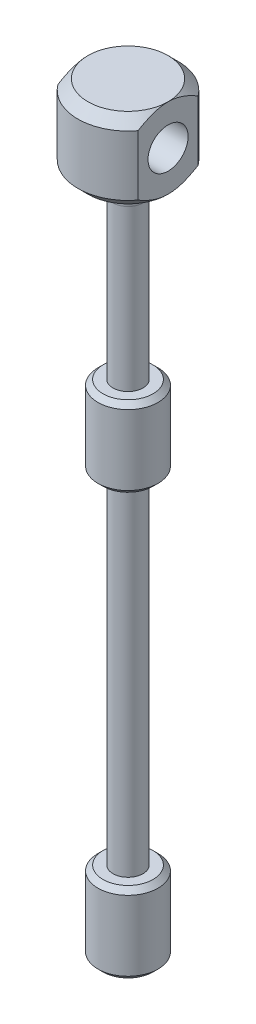
ISO-10303-21;
HEADER;
FILE_DESCRIPTION(('STEP AP214'),'2;1');
FILE_NAME('part.step','',(''),(''),'','','');
FILE_SCHEMA(('AUTOMOTIVE_DESIGN { 1 0 10303 214 1 1 1 1 }'));
ENDSEC;
DATA;
#1=APPLICATION_CONTEXT('core data for automotive mechanical design processes');
#2=APPLICATION_PROTOCOL_DEFINITION('international standard','automotive_design',2000,#1);
#3=PRODUCT_CONTEXT('',#1,'mechanical');
#4=PRODUCT('Part','Part','',(#3));
#5=PRODUCT_RELATED_PRODUCT_CATEGORY('part','',(#4));
#6=PRODUCT_DEFINITION_FORMATION('','',#4);
#7=PRODUCT_DEFINITION_CONTEXT('part definition',#1,'design');
#8=PRODUCT_DEFINITION('design','',#6,#7);
#9=PRODUCT_DEFINITION_SHAPE('','',#8);
#10=(LENGTH_UNIT() NAMED_UNIT(*) SI_UNIT(.MILLI.,.METRE.));
#11=(NAMED_UNIT(*) PLANE_ANGLE_UNIT() SI_UNIT($,.RADIAN.));
#12=(NAMED_UNIT(*) SI_UNIT($,.STERADIAN.) SOLID_ANGLE_UNIT());
#13=UNCERTAINTY_MEASURE_WITH_UNIT(LENGTH_MEASURE(1.E-05),#10,'distance_accuracy_value','');
#14=(GEOMETRIC_REPRESENTATION_CONTEXT(3) GLOBAL_UNCERTAINTY_ASSIGNED_CONTEXT((#13)) GLOBAL_UNIT_ASSIGNED_CONTEXT((#10,
#11,#12)) REPRESENTATION_CONTEXT('',''));
#15=CARTESIAN_POINT('',(0.,0.,0.));
#16=DIRECTION('',(0.,0.,1.));
#17=DIRECTION('',(1.,0.,0.));
#18=AXIS2_PLACEMENT_3D('',#15,#16,#17);
#19=CARTESIAN_POINT('',(0.,51.,0.));
#20=DIRECTION('',(0.,-1.,0.));
#21=DIRECTION('',(0.,0.,-1.));
#22=AXIS2_PLACEMENT_3D('',#19,#20,#21);
#23=CYLINDRICAL_SURFACE('',#22,5.);
#24=CARTESIAN_POINT('',(0.,50.,0.));
#25=DIRECTION('',(0.,1.,0.));
#26=DIRECTION('',(0.,0.,1.));
#27=AXIS2_PLACEMENT_3D('',#24,#25,#26);
#28=CIRCLE('',#27,5.);
#29=CARTESIAN_POINT('',(-4.,50.,-3.));
#30=VERTEX_POINT('',#29);
#31=CARTESIAN_POINT('',(4.,50.,-3.));
#32=VERTEX_POINT('',#31);
#33=EDGE_CURVE('E126',#30,#32,#28,.F.);
#34=ORIENTED_EDGE('',*,*,#33,.T.);
#35=DIRECTION('',(0.,1.,0.));
#36=VECTOR('',#35,1.);
#37=CARTESIAN_POINT('',(4.,39.,-3.));
#38=LINE('',#37,#36);
#39=CARTESIAN_POINT('',(4.,44.,-3.));
#40=VERTEX_POINT('',#39);
#41=EDGE_CURVE('E118',#40,#32,#38,.T.);
#42=ORIENTED_EDGE('',*,*,#41,.F.);
#43=CARTESIAN_POINT('',(0.,44.,0.));
#44=DIRECTION('',(0.,1.,0.));
#45=DIRECTION('',(0.,0.,1.));
#46=AXIS2_PLACEMENT_3D('',#43,#44,#45);
#47=CIRCLE('',#46,5.);
#48=CARTESIAN_POINT('',(-4.,44.,-3.));
#49=VERTEX_POINT('',#48);
#50=EDGE_CURVE('E125',#40,#49,#47,.T.);
#51=ORIENTED_EDGE('',*,*,#50,.T.);
#52=DIRECTION('',(0.,1.,0.));
#53=VECTOR('',#52,1.);
#54=CARTESIAN_POINT('',(-4.,39.,-3.));
#55=LINE('',#54,#53);
#56=EDGE_CURVE('E119',#49,#30,#55,.T.);
#57=ORIENTED_EDGE('',*,*,#56,.T.);
#58=EDGE_LOOP('',(#34,#42,#51,#57));
#59=FACE_BOUND('',#58,.T.);
#60=ADVANCED_FACE('F44',(#59),#23,.T.);
#61=CARTESIAN_POINT('',(0.,44.,0.));
#62=DIRECTION('',(0.,1.,0.));
#63=DIRECTION('',(0.,0.,1.));
#64=AXIS2_PLACEMENT_3D('',#61,#62,#63);
#65=CONICAL_SURFACE('',#64,5.,0.785398163397457);
#66=CARTESIAN_POINT('',(4.,48.9247271159866,9.08296253029822));
#67=CARTESIAN_POINT('',(4.,48.802387308154,8.94928239634458));
#68=CARTESIAN_POINT('',(4.,48.6802835779062,8.81538630169196));
#69=CARTESIAN_POINT('',(4.,48.4366180772877,8.547099951568));
#70=CARTESIAN_POINT('',(4.,48.3150563114026,8.41270969202352));
#71=CARTESIAN_POINT('',(4.,47.9512341073232,8.00864366411494));
#72=CARTESIAN_POINT('',(4.,47.709894934558,7.73813607887684));
#73=CARTESIAN_POINT('',(4.,47.2288400403011,7.19239450382374));
#74=CARTESIAN_POINT('',(4.,46.9891465643369,6.91714087282059));
#75=CARTESIAN_POINT('',(4.,46.5142934736962,6.36279335301774));
#76=CARTESIAN_POINT('',(4.,46.279133283012,6.08369995993133));
#77=CARTESIAN_POINT('',(4.,45.8529266812118,5.56601292870094));
#78=CARTESIAN_POINT('',(4.,45.6609225381446,5.32820953471586));
#79=CARTESIAN_POINT('',(4.,45.283079069338,4.84760383245386));
#80=CARTESIAN_POINT('',(4.,45.0972414683962,4.60480015585305));
#81=CARTESIAN_POINT('',(4.,44.8253597430741,4.23575942166701));
#82=CARTESIAN_POINT('',(4.,44.7359307479011,4.11201693841399));
#83=CARTESIAN_POINT('',(4.,44.5598339114749,3.86258645224428));
#84=CARTESIAN_POINT('',(4.,44.4731659154183,3.73689855899186));
#85=CARTESIAN_POINT('',(4.,44.3032655779973,3.48331443898917));
#86=CARTESIAN_POINT('',(4.,44.2200313620893,3.35541947267827));
#87=CARTESIAN_POINT('',(4.,44.0577690442731,3.0969584761606));
#88=CARTESIAN_POINT('',(4.,43.9787413397006,2.96639219523556));
#89=CARTESIAN_POINT('',(4.,43.8273688499903,2.70456899365729));
#90=CARTESIAN_POINT('',(4.,43.7549289701323,2.57336738263271));
#91=CARTESIAN_POINT('',(4.,43.616517257277,2.3076165751305));
#92=CARTESIAN_POINT('',(4.,43.5505435154787,2.17306838135653));
#93=CARTESIAN_POINT('',(4.,43.4268211239929,1.90039155991626));
#94=CARTESIAN_POINT('',(4.,43.3690631286312,1.76226721519646));
#95=CARTESIAN_POINT('',(4.,43.2637935267489,1.4821455277873));
#96=CARTESIAN_POINT('',(4.,43.2162790157123,1.3401492958605));
#97=CARTESIAN_POINT('',(4.,43.1420603720111,1.08112957156392));
#98=CARTESIAN_POINT('',(4.,43.1130967414613,0.964757290284658));
#99=CARTESIAN_POINT('',(4.,43.0644611384574,0.730073935334261));
#100=CARTESIAN_POINT('',(4.,43.0447878626829,0.611763136023948));
#101=CARTESIAN_POINT('',(4.,43.0157359195884,0.374159664621397));
#102=CARTESIAN_POINT('',(4.,43.0063322037335,0.25487009983417));
#103=CARTESIAN_POINT('',(4.,42.9982495503698,0.0159232868171672));
#104=CARTESIAN_POINT('',(4.,42.9995704899806,-0.103733957184136));
#105=CARTESIAN_POINT('',(4.,43.0128567900539,-0.342350024716042));
#106=CARTESIAN_POINT('',(4.,43.0248136188397,-0.461309331130433));
#107=CARTESIAN_POINT('',(4.,43.0587188417465,-0.697783867555404));
#108=CARTESIAN_POINT('',(4.,43.0806680927346,-0.815298972835573));
#109=CARTESIAN_POINT('',(4.,43.1335965405288,-1.04860650527933));
#110=CARTESIAN_POINT('',(4.,43.1646015050413,-1.16439301162997));
#111=CARTESIAN_POINT('',(4.,43.2343948872562,-1.39356328206134));
#112=CARTESIAN_POINT('',(4.,43.2731831287733,-1.50694710046607));
#113=CARTESIAN_POINT('',(4.,43.3687598244992,-1.76168878408499));
#114=CARTESIAN_POINT('',(4.,43.4275759984106,-1.90228196802005));
#115=CARTESIAN_POINT('',(4.,43.5536429738204,-2.17966539075199));
#116=CARTESIAN_POINT('',(4.,43.6208980188947,-2.31645367363607));
#117=CARTESIAN_POINT('',(4.,43.7621568139408,-2.58678179197293));
#118=CARTESIAN_POINT('',(4.,43.8361723041079,-2.72031544586681));
#119=CARTESIAN_POINT('',(4.,43.9894641274028,-2.9843432893622));
#120=CARTESIAN_POINT('',(4.,44.0687415105719,-3.11483686523687));
#121=CARTESIAN_POINT('',(4.,44.2323117126117,-3.37451583900959));
#122=CARTESIAN_POINT('',(4.,44.3166478737789,-3.50367380755503));
#123=CARTESIAN_POINT('',(4.,44.4887452269034,-3.75969456122139));
#124=CARTESIAN_POINT('',(4.,44.5765067139582,-3.88655714720715));
#125=CARTESIAN_POINT('',(4.,44.7548280395107,-4.13835078342402));
#126=CARTESIAN_POINT('',(4.,44.8453886967006,-4.26328125221571));
#127=CARTESIAN_POINT('',(4.,45.0287887156797,-4.51146029500128));
#128=CARTESIAN_POINT('',(4.,45.1216281535124,-4.63470881265392));
#129=CARTESIAN_POINT('',(4.,45.3625723648332,-4.94951284060179));
#130=CARTESIAN_POINT('',(4.,45.5120531650481,-5.14001460272359));
#131=CARTESIAN_POINT('',(4.,45.8144911300992,-5.51816455056922));
#132=CARTESIAN_POINT('',(4.,45.9674476096394,-5.7058132868496));
#133=CARTESIAN_POINT('',(4.,46.2761874541715,-6.07897096360208));
#134=CARTESIAN_POINT('',(4.,46.4319725831541,-6.26447844195869));
#135=CARTESIAN_POINT('',(4.,46.7457105615887,-6.63366350338082));
#136=CARTESIAN_POINT('',(4.,46.9036635172977,-6.81734099598158));
#137=CARTESIAN_POINT('',(4.,47.2152118752722,-7.17616308537228));
#138=CARTESIAN_POINT('',(4.,47.3687418197841,-7.35136459027149));
#139=CARTESIAN_POINT('',(4.,47.6771228146109,-7.7005954526756));
#140=CARTESIAN_POINT('',(4.,47.831973845433,-7.87462482740793));
#141=CARTESIAN_POINT('',(4.,48.1426141934733,-8.22151803823496));
#142=CARTESIAN_POINT('',(4.,48.2984023706677,-8.39438289616608));
#143=CARTESIAN_POINT('',(4.,48.6109088349245,-8.73926967039177));
#144=CARTESIAN_POINT('',(4.,48.7676271207382,-8.91129158781749));
#145=CARTESIAN_POINT('',(4.,48.9247271159866,-9.08296253029822));
#146=B_SPLINE_CURVE_WITH_KNOTS('',3,(#66,#67,#68,#69,#70,#71,#72,#73,#74,#75,#76,#77,#78,#79,
#80,#81,#82,#83,#84,#85,#86,#87,#88,#89,#90,#91,#92,#93,#94,#95,#96,#97,#98,#99,#100,#101,#102,
#103,#104,#105,#106,#107,#108,#109,#110,#111,#112,#113,#114,#115,#116,#117,#118,#119,#120,#121,
#122,#123,#124,#125,#126,#127,#128,#129,#130,#131,#132,#133,#134,#135,#136,#137,#138,#139,#140,
#141,#142,#143,#144,#145),.UNSPECIFIED.,.F.,.F.,(4,2,2,2,2,2,2,2,2,2,2,2,2,2,2,2,2,2,2,2,2,2,2,
2,2,2,2,2,2,2,2,2,2,2,2,2,2,2,2,4),(0.,0.543632214749334,1.08726892044482,2.17480052651795,
3.26973765913902,4.36453473764938,5.28139143862595,6.19850246137593,6.65649947916985,
7.11447077267207,7.57218865305421,8.02994969178006,8.47942236360687,8.9287619491405,
9.37758623737537,9.82628309465803,10.1857235229971,10.5451135113491,10.9036249383241,
11.2621322575772,11.6203522559547,11.9786029780918,12.3378831896853,12.6971552693856,
13.1539895924553,13.6110545671466,14.0689289463761,14.5268949734115,14.9895907655923,
15.4523265081661,15.9151988952749,16.3780867496012,17.1044694557083,17.8307101635658,
18.5574204797457,19.2841665441189,19.9830170914991,20.6818573449808,21.3799726243428,
22.0780869666573),.UNSPECIFIED.);
#147=CARTESIAN_POINT('',(4.,44.,3.));
#148=VERTEX_POINT('',#147);
#149=CARTESIAN_POINT('',(4.,43.,0.));
#150=VERTEX_POINT('',#149);
#151=EDGE_CURVE('E123',#148,#150,#146,.T.);
#152=ORIENTED_EDGE('',*,*,#151,.F.);
#153=CARTESIAN_POINT('',(-4.,44.,3.));
#154=VERTEX_POINT('',#153);
#155=EDGE_CURVE('E114',#154,#148,#47,.T.);
#156=ORIENTED_EDGE('',*,*,#155,.F.);
#157=CARTESIAN_POINT('',(-4.,48.9247271159866,-9.08296253029822));
#158=CARTESIAN_POINT('',(-4.,48.802387308154,-8.94928239634458));
#159=CARTESIAN_POINT('',(-4.,48.6802835779062,-8.81538630169197));
#160=CARTESIAN_POINT('',(-4.,48.4366180772877,-8.54709995156801));
#161=CARTESIAN_POINT('',(-4.,48.3150563114026,-8.41270969202353));
#162=CARTESIAN_POINT('',(-4.,47.9512341073232,-8.00864366411494));
#163=CARTESIAN_POINT('',(-4.,47.709894934558,-7.73813607887684));
#164=CARTESIAN_POINT('',(-4.,47.2288400403011,-7.19239450382374));
#165=CARTESIAN_POINT('',(-4.,46.9891465643369,-6.91714087282059));
#166=CARTESIAN_POINT('',(-4.,46.5142934736961,-6.36279335301774));
#167=CARTESIAN_POINT('',(-4.,46.279133283012,-6.08369995993133));
#168=CARTESIAN_POINT('',(-4.,45.8529266812118,-5.56601292870094));
#169=CARTESIAN_POINT('',(-4.,45.6609225381446,-5.32820953471585));
#170=CARTESIAN_POINT('',(-4.,45.283079069338,-4.84760383245385));
#171=CARTESIAN_POINT('',(-4.,45.0972414683962,-4.60480015585304));
#172=CARTESIAN_POINT('',(-4.,44.8253597430741,-4.235759421667));
#173=CARTESIAN_POINT('',(-4.,44.7359307479011,-4.11201693841398));
#174=CARTESIAN_POINT('',(-4.,44.5598339114749,-3.86258645224427));
#175=CARTESIAN_POINT('',(-4.,44.4731659154183,-3.73689855899184));
#176=CARTESIAN_POINT('',(-4.,44.3032655779972,-3.48331443898915));
#177=CARTESIAN_POINT('',(-4.,44.2200313620893,-3.35541947267825));
#178=CARTESIAN_POINT('',(-4.,44.0577690442731,-3.09695847616058));
#179=CARTESIAN_POINT('',(-4.,43.9787413397006,-2.96639219523554));
#180=CARTESIAN_POINT('',(-4.,43.8273688499902,-2.70456899365727));
#181=CARTESIAN_POINT('',(-4.,43.7549289701323,-2.57336738263268));
#182=CARTESIAN_POINT('',(-4.,43.6165172572769,-2.30761657513048));
#183=CARTESIAN_POINT('',(-4.,43.5505435154786,-2.17306838135651));
#184=CARTESIAN_POINT('',(-4.,43.4268211239929,-1.90039155991624));
#185=CARTESIAN_POINT('',(-4.,43.3690631286311,-1.76226721519644));
#186=CARTESIAN_POINT('',(-4.,43.2637935267489,-1.48214552778728));
#187=CARTESIAN_POINT('',(-4.,43.2162790157123,-1.34014929586049));
#188=CARTESIAN_POINT('',(-4.,43.1420603720111,-1.08112957156391));
#189=CARTESIAN_POINT('',(-4.,43.1130967414613,-0.964757290284645));
#190=CARTESIAN_POINT('',(-4.,43.0644611384574,-0.730073935334248));
#191=CARTESIAN_POINT('',(-4.,43.0447878626829,-0.611763136023936));
#192=CARTESIAN_POINT('',(-4.,43.0157359195884,-0.374159664621386));
#193=CARTESIAN_POINT('',(-4.,43.0063322037335,-0.254870099834158));
#194=CARTESIAN_POINT('',(-4.,42.9982495503698,-0.0159232868171549));
#195=CARTESIAN_POINT('',(-4.,42.9995704899806,0.103733957184148));
#196=CARTESIAN_POINT('',(-4.,43.0128567900539,0.342350024716054));
#197=CARTESIAN_POINT('',(-4.,43.0248136188397,0.461309331130446));
#198=CARTESIAN_POINT('',(-4.,43.0587188417465,0.697783867555416));
#199=CARTESIAN_POINT('',(-4.,43.0806680927346,0.815298972835586));
#200=CARTESIAN_POINT('',(-4.,43.1335965405288,1.04860650527934));
#201=CARTESIAN_POINT('',(-4.,43.1646015050413,1.16439301162997));
#202=CARTESIAN_POINT('',(-4.,43.2343948872562,1.39356328206135));
#203=CARTESIAN_POINT('',(-4.,43.2731831287733,1.50694710046607));
#204=CARTESIAN_POINT('',(-4.,43.3687598244992,1.761688784085));
#205=CARTESIAN_POINT('',(-4.,43.4275759984106,1.90228196802007));
#206=CARTESIAN_POINT('',(-4.,43.5536429738204,2.17966539075201));
#207=CARTESIAN_POINT('',(-4.,43.6208980188947,2.31645367363609));
#208=CARTESIAN_POINT('',(-4.,43.7621568139408,2.58678179197294));
#209=CARTESIAN_POINT('',(-4.,43.8361723041079,2.72031544586682));
#210=CARTESIAN_POINT('',(-4.,43.9894641274029,2.98434328936221));
#211=CARTESIAN_POINT('',(-4.,44.0687415105719,3.11483686523688));
#212=CARTESIAN_POINT('',(-4.,44.2323117126117,3.37451583900961));
#213=CARTESIAN_POINT('',(-4.,44.3166478737789,3.50367380755505));
#214=CARTESIAN_POINT('',(-4.,44.4887452269034,3.75969456122141));
#215=CARTESIAN_POINT('',(-4.,44.5765067139582,3.88655714720717));
#216=CARTESIAN_POINT('',(-4.,44.7548280395107,4.13835078342405));
#217=CARTESIAN_POINT('',(-4.,44.8453886967006,4.26328125221574));
#218=CARTESIAN_POINT('',(-4.,45.0287887156798,4.51146029500131));
#219=CARTESIAN_POINT('',(-4.,45.1216281535124,4.63470881265395));
#220=CARTESIAN_POINT('',(-4.,45.3625723648332,4.94951284060182));
#221=CARTESIAN_POINT('',(-4.,45.5120531650482,5.14001460272362));
#222=CARTESIAN_POINT('',(-4.,45.8144911300992,5.51816455056925));
#223=CARTESIAN_POINT('',(-4.,45.9674476096394,5.70581328684963));
#224=CARTESIAN_POINT('',(-4.,46.2761874541716,6.0789709636021));
#225=CARTESIAN_POINT('',(-4.,46.4319725831542,6.26447844195871));
#226=CARTESIAN_POINT('',(-4.,46.7457105615887,6.63366350338083));
#227=CARTESIAN_POINT('',(-4.,46.9036635172977,6.8173409959816));
#228=CARTESIAN_POINT('',(-4.,47.2152118752722,7.17616308537229));
#229=CARTESIAN_POINT('',(-4.,47.3687418197841,7.35136459027151));
#230=CARTESIAN_POINT('',(-4.,47.6771228146109,7.70059545267562));
#231=CARTESIAN_POINT('',(-4.,47.831973845433,7.87462482740794));
#232=CARTESIAN_POINT('',(-4.,48.1426141934733,8.22151803823497));
#233=CARTESIAN_POINT('',(-4.,48.2984023706677,8.39438289616609));
#234=CARTESIAN_POINT('',(-4.,48.6109088349246,8.73926967039178));
#235=CARTESIAN_POINT('',(-4.,48.7676271207382,8.91129158781749));
#236=CARTESIAN_POINT('',(-4.,48.9247271159866,9.08296253029823));
#237=B_SPLINE_CURVE_WITH_KNOTS('',3,(#157,#158,#159,#160,#161,#162,#163,#164,#165,#166,#167,
#168,#169,#170,#171,#172,#173,#174,#175,#176,#177,#178,#179,#180,#181,#182,#183,#184,#185,#186,
#187,#188,#189,#190,#191,#192,#193,#194,#195,#196,#197,#198,#199,#200,#201,#202,#203,#204,#205,
#206,#207,#208,#209,#210,#211,#212,#213,#214,#215,#216,#217,#218,#219,#220,#221,#222,#223,#224,
#225,#226,#227,#228,#229,#230,#231,#232,#233,#234,#235,#236),.UNSPECIFIED.,.F.,.F.,(4,2,2,2,2,2,
2,2,2,2,2,2,2,2,2,2,2,2,2,2,2,2,2,2,2,2,2,2,2,2,2,2,2,2,2,2,2,2,2,4),(0.,0.543632214749333,
1.08726892044482,2.17480052651796,3.26973765913903,4.3645347376494,5.28139143862597,
6.19850246137595,6.65649947916988,7.1144707726721,7.57218865305424,8.0299496917801,
8.4794223636069,8.92876194914054,9.3775862373754,9.82628309465806,10.1857235229971,
10.5451135113491,10.9036249383242,11.2621322575772,11.6203522559548,11.9786029780919,
12.3378831896853,12.6971552693856,13.1539895924553,13.6110545671466,14.0689289463761,
14.5268949734115,14.9895907655923,15.4523265081662,15.915198895275,16.3780867496013,
17.1044694557083,17.8307101635658,18.5574204797457,19.2841665441189,19.9830170914991,
20.6818573449808,21.3799726243428,22.0780869666573),.UNSPECIFIED.);
#238=CARTESIAN_POINT('',(-4.,43.,0.));
#239=VERTEX_POINT('',#238);
#240=EDGE_CURVE('E96',#239,#154,#237,.T.);
#241=ORIENTED_EDGE('',*,*,#240,.F.);
#242=CARTESIAN_POINT('',(0.,43.,0.));
#243=DIRECTION('',(0.,1.,0.));
#244=DIRECTION('',(0.,0.,1.));
#245=AXIS2_PLACEMENT_3D('',#242,#243,#244);
#246=CIRCLE('',#245,3.99999999999998);
#247=EDGE_CURVE('E131',#150,#239,#246,.F.);
#248=ORIENTED_EDGE('',*,*,#247,.F.);
#249=EDGE_LOOP('',(#152,#156,#241,#248));
#250=FACE_BOUND('',#249,.T.);
#251=ADVANCED_FACE('F122',(#250),#65,.T.);
#252=CARTESIAN_POINT('',(0.,51.,0.));
#253=DIRECTION('',(0.,-1.,0.));
#254=DIRECTION('',(0.,0.,-1.));
#255=AXIS2_PLACEMENT_3D('',#252,#253,#254);
#256=CONICAL_SURFACE('',#255,4.,0.78539816339745);
#257=CARTESIAN_POINT('',(4.,45.0752728840133,-9.08296253029822));
#258=CARTESIAN_POINT('',(4.,45.1976126918459,-8.94928239634458));
#259=CARTESIAN_POINT('',(4.,45.3197164220938,-8.81538630169196));
#260=CARTESIAN_POINT('',(4.,45.5633819227122,-8.547099951568));
#261=CARTESIAN_POINT('',(4.,45.6849436885974,-8.41270969202352));
#262=CARTESIAN_POINT('',(4.,46.0487658926767,-8.00864366411494));
#263=CARTESIAN_POINT('',(4.,46.2901050654419,-7.73813607887685));
#264=CARTESIAN_POINT('',(4.,46.7711599596989,-7.19239450382375));
#265=CARTESIAN_POINT('',(4.,47.010853435663,-6.9171408728206));
#266=CARTESIAN_POINT('',(4.,47.4857065263038,-6.36279335301776));
#267=CARTESIAN_POINT('',(4.,47.7208667169879,-6.08369995993136));
#268=CARTESIAN_POINT('',(4.,48.1470733187882,-5.56601292870097));
#269=CARTESIAN_POINT('',(4.,48.3390774618554,-5.32820953471589));
#270=CARTESIAN_POINT('',(4.,48.7169209306619,-4.84760383245389));
#271=CARTESIAN_POINT('',(4.,48.9027585316037,-4.60480015585309));
#272=CARTESIAN_POINT('',(4.,49.1746402569258,-4.23575942166707));
#273=CARTESIAN_POINT('',(4.,49.2640692520988,-4.11201693841405));
#274=CARTESIAN_POINT('',(4.,49.440166088525,-3.86258645224435));
#275=CARTESIAN_POINT('',(4.,49.5268340845816,-3.73689855899192));
#276=CARTESIAN_POINT('',(4.,49.6967344220027,-3.48331443898925));
#277=CARTESIAN_POINT('',(4.,49.7799686379106,-3.35541947267835));
#278=CARTESIAN_POINT('',(4.,49.9422309557268,-3.09695847616069));
#279=CARTESIAN_POINT('',(4.,50.0212586602994,-2.96639219523565));
#280=CARTESIAN_POINT('',(4.,50.1726311500097,-2.70456899365739));
#281=CARTESIAN_POINT('',(4.,50.2450710298676,-2.57336738263279));
#282=CARTESIAN_POINT('',(4.,50.383482742723,-2.30761657513059));
#283=CARTESIAN_POINT('',(4.,50.4494564845213,-2.17306838135662));
#284=CARTESIAN_POINT('',(4.,50.573178876007,-1.90039155991635));
#285=CARTESIAN_POINT('',(4.,50.6309368713688,-1.76226721519655));
#286=CARTESIAN_POINT('',(4.,50.7362064732511,-1.48214552778739));
#287=CARTESIAN_POINT('',(4.,50.7837209842877,-1.34014929586059));
#288=CARTESIAN_POINT('',(4.,50.8579396279889,-1.08112957156401));
#289=CARTESIAN_POINT('',(4.,50.8869032585387,-0.964757290284748));
#290=CARTESIAN_POINT('',(4.,50.9355388615425,-0.730073935334353));
#291=CARTESIAN_POINT('',(4.,50.9552121373171,-0.611763136024042));
#292=CARTESIAN_POINT('',(4.,50.9842640804116,-0.374159664621493));
#293=CARTESIAN_POINT('',(4.,50.9936677962665,-0.254870099834266));
#294=CARTESIAN_POINT('',(4.,51.0017504496302,-0.0159232868172639));
#295=CARTESIAN_POINT('',(4.,51.0004295100194,0.103733957184039));
#296=CARTESIAN_POINT('',(4.,50.9871432099461,0.342350024715945));
#297=CARTESIAN_POINT('',(4.,50.9751863811603,0.461309331130337));
#298=CARTESIAN_POINT('',(4.,50.9412811582535,0.697783867555308));
#299=CARTESIAN_POINT('',(4.,50.9193319072655,0.815298972835478));
#300=CARTESIAN_POINT('',(4.,50.8664034594712,1.04860650527923));
#301=CARTESIAN_POINT('',(4.,50.8353984949588,1.16439301162987));
#302=CARTESIAN_POINT('',(4.,50.7656051127438,1.39356328206125));
#303=CARTESIAN_POINT('',(4.,50.7268168712267,1.50694710046597));
#304=CARTESIAN_POINT('',(4.,50.6312401755009,1.76168878408489));
#305=CARTESIAN_POINT('',(4.,50.5724240015895,1.90228196801994));
#306=CARTESIAN_POINT('',(4.,50.4463570261797,2.17966539075186));
#307=CARTESIAN_POINT('',(4.,50.3791019811054,2.31645367363593));
#308=CARTESIAN_POINT('',(4.,50.2378431860593,2.58678179197277));
#309=CARTESIAN_POINT('',(4.,50.1638276958922,2.72031544586663));
#310=CARTESIAN_POINT('',(4.,50.0105358725973,2.984343289362));
#311=CARTESIAN_POINT('',(4.,49.9312584894282,3.11483686523666));
#312=CARTESIAN_POINT('',(4.,49.7676882873885,3.37451583900936));
#313=CARTESIAN_POINT('',(4.,49.6833521262213,3.5036738075548));
#314=CARTESIAN_POINT('',(4.,49.5112547730968,3.75969456122114));
#315=CARTESIAN_POINT('',(4.,49.423493286042,3.88655714720688));
#316=CARTESIAN_POINT('',(4.,49.2451719604895,4.13835078342374));
#317=CARTESIAN_POINT('',(4.,49.1546113032996,4.26328125221542));
#318=CARTESIAN_POINT('',(4.,48.9712112843205,4.51146029500097));
#319=CARTESIAN_POINT('',(4.,48.8783718464879,4.63470881265359));
#320=CARTESIAN_POINT('',(4.,48.637427635167,4.94951284060147));
#321=CARTESIAN_POINT('',(4.,48.4879468349521,5.14001460272329));
#322=CARTESIAN_POINT('',(4.,48.185508869901,5.51816455056896));
#323=CARTESIAN_POINT('',(4.,48.0325523903608,5.70581328684935));
#324=CARTESIAN_POINT('',(4.,47.7238125458286,6.07897096360185));
#325=CARTESIAN_POINT('',(4.,47.568027416846,6.26447844195848));
#326=CARTESIAN_POINT('',(4.,47.2542894384115,6.63366350338064));
#327=CARTESIAN_POINT('',(4.,47.0963364827024,6.81734099598142));
#328=CARTESIAN_POINT('',(4.,46.7847881247279,7.17616308537214));
#329=CARTESIAN_POINT('',(4.,46.631258180216,7.35136459027137));
#330=CARTESIAN_POINT('',(4.,46.3228771853891,7.7005954526755));
#331=CARTESIAN_POINT('',(4.,46.168026154567,7.87462482740784));
#332=CARTESIAN_POINT('',(4.,45.8573858065267,8.2215180382349));
#333=CARTESIAN_POINT('',(4.,45.7015976293323,8.39438289616603));
#334=CARTESIAN_POINT('',(4.,45.3890911650754,8.73926967039175));
#335=CARTESIAN_POINT('',(4.,45.2323728792617,8.91129158781747));
#336=CARTESIAN_POINT('',(4.,45.0752728840133,9.08296253029822));
#337=B_SPLINE_CURVE_WITH_KNOTS('',3,(#257,#258,#259,#260,#261,#262,#263,#264,#265,#266,#267,
#268,#269,#270,#271,#272,#273,#274,#275,#276,#277,#278,#279,#280,#281,#282,#283,#284,#285,#286,
#287,#288,#289,#290,#291,#292,#293,#294,#295,#296,#297,#298,#299,#300,#301,#302,#303,#304,#305,
#306,#307,#308,#309,#310,#311,#312,#313,#314,#315,#316,#317,#318,#319,#320,#321,#322,#323,#324,
#325,#326,#327,#328,#329,#330,#331,#332,#333,#334,#335,#336),.UNSPECIFIED.,.F.,.F.,(4,2,2,2,2,2,
2,2,2,2,2,2,2,2,2,2,2,2,2,2,2,2,2,2,2,2,2,2,2,2,2,2,2,2,2,2,2,2,2,4),(0.,0.543632214749333,
1.08726892044483,2.17480052651796,3.26973765913901,4.36453473764938,5.28139143862593,
6.1985024613759,6.65649947916982,7.11447077267202,7.57218865305415,8.02994969178,
8.47942236360681,8.92876194914045,9.37758623737532,9.82628309465798,10.1857235229971,
10.5451135113491,10.9036249383241,11.2621322575771,11.6203522559547,11.9786029780918,
12.3378831896852,12.6971552693855,13.1539895924552,13.6110545671464,14.0689289463759,
14.5268949734113,14.989590765592,15.4523265081659,15.9151988952746,16.3780867496009,
17.104469455708,17.8307101635656,18.5574204797455,19.2841665441188,19.983017091499,
20.6818573449808,21.3799726243428,22.0780869666574),.UNSPECIFIED.);
#338=CARTESIAN_POINT('',(4.,51.,0.));
#339=VERTEX_POINT('',#338);
#340=EDGE_CURVE('E68',#32,#339,#337,.T.);
#341=ORIENTED_EDGE('',*,*,#340,.F.);
#342=ORIENTED_EDGE('',*,*,#33,.F.);
#343=CARTESIAN_POINT('',(-4.,45.0752728840133,9.08296253029822));
#344=CARTESIAN_POINT('',(-4.,45.1976126918459,8.94928239634458));
#345=CARTESIAN_POINT('',(-4.,45.3197164220937,8.81538630169197));
#346=CARTESIAN_POINT('',(-4.,45.5633819227122,8.54709995156801));
#347=CARTESIAN_POINT('',(-4.,45.6849436885974,8.41270969202353));
#348=CARTESIAN_POINT('',(-4.,46.0487658926767,8.00864366411495));
#349=CARTESIAN_POINT('',(-4.,46.2901050654419,7.73813607887686));
#350=CARTESIAN_POINT('',(-4.,46.7711599596989,7.19239450382375));
#351=CARTESIAN_POINT('',(-4.,47.010853435663,6.91714087282061));
#352=CARTESIAN_POINT('',(-4.,47.4857065263038,6.36279335301777));
#353=CARTESIAN_POINT('',(-4.,47.7208667169879,6.08369995993136));
#354=CARTESIAN_POINT('',(-4.,48.1470733187882,5.56601292870098));
#355=CARTESIAN_POINT('',(-4.,48.3390774618554,5.32820953471589));
#356=CARTESIAN_POINT('',(-4.,48.7169209306619,4.8476038324539));
#357=CARTESIAN_POINT('',(-4.,48.9027585316037,4.6048001558531));
#358=CARTESIAN_POINT('',(-4.,49.1746402569258,4.23575942166708));
#359=CARTESIAN_POINT('',(-4.,49.2640692520988,4.11201693841406));
#360=CARTESIAN_POINT('',(-4.,49.440166088525,3.86258645224435));
#361=CARTESIAN_POINT('',(-4.,49.5268340845816,3.73689855899193));
#362=CARTESIAN_POINT('',(-4.,49.6967344220027,3.48331443898925));
#363=CARTESIAN_POINT('',(-4.,49.7799686379106,3.35541947267835));
#364=CARTESIAN_POINT('',(-4.,49.9422309557268,3.09695847616069));
#365=CARTESIAN_POINT('',(-4.,50.0212586602994,2.96639219523566));
#366=CARTESIAN_POINT('',(-4.,50.1726311500097,2.70456899365739));
#367=CARTESIAN_POINT('',(-4.,50.2450710298676,2.5733673826328));
#368=CARTESIAN_POINT('',(-4.,50.383482742723,2.30761657513059));
#369=CARTESIAN_POINT('',(-4.,50.4494564845213,2.17306838135662));
#370=CARTESIAN_POINT('',(-4.,50.573178876007,1.90039155991636));
#371=CARTESIAN_POINT('',(-4.,50.6309368713688,1.76226721519655));
#372=CARTESIAN_POINT('',(-4.,50.7362064732511,1.48214552778739));
#373=CARTESIAN_POINT('',(-4.,50.7837209842877,1.34014929586059));
#374=CARTESIAN_POINT('',(-4.,50.8579396279889,1.08112957156402));
#375=CARTESIAN_POINT('',(-4.,50.8869032585387,0.96475729028475));
#376=CARTESIAN_POINT('',(-4.,50.9355388615425,0.730073935334355));
#377=CARTESIAN_POINT('',(-4.,50.9552121373171,0.611763136024044));
#378=CARTESIAN_POINT('',(-4.,50.9842640804116,0.374159664621497));
#379=CARTESIAN_POINT('',(-4.,50.9936677962665,0.25487009983427));
#380=CARTESIAN_POINT('',(-4.,51.0017504496302,0.0159232868172684));
#381=CARTESIAN_POINT('',(-4.,51.0004295100194,-0.103733957184034));
#382=CARTESIAN_POINT('',(-4.,50.9871432099461,-0.34235002471594));
#383=CARTESIAN_POINT('',(-4.,50.9751863811603,-0.461309331130333));
#384=CARTESIAN_POINT('',(-4.,50.9412811582535,-0.697783867555305));
#385=CARTESIAN_POINT('',(-4.,50.9193319072655,-0.815298972835474));
#386=CARTESIAN_POINT('',(-4.,50.8664034594712,-1.04860650527923));
#387=CARTESIAN_POINT('',(-4.,50.8353984949588,-1.16439301162987));
#388=CARTESIAN_POINT('',(-4.,50.7656051127438,-1.39356328206124));
#389=CARTESIAN_POINT('',(-4.,50.7268168712267,-1.50694710046597));
#390=CARTESIAN_POINT('',(-4.,50.6312401755009,-1.76168878408488));
#391=CARTESIAN_POINT('',(-4.,50.5724240015895,-1.90228196801994));
#392=CARTESIAN_POINT('',(-4.,50.4463570261797,-2.17966539075185));
#393=CARTESIAN_POINT('',(-4.,50.3791019811054,-2.31645367363592));
#394=CARTESIAN_POINT('',(-4.,50.2378431860593,-2.58678179197276));
#395=CARTESIAN_POINT('',(-4.,50.1638276958922,-2.72031544586662));
#396=CARTESIAN_POINT('',(-4.,50.0105358725973,-2.98434328936199));
#397=CARTESIAN_POINT('',(-4.,49.9312584894282,-3.11483686523665));
#398=CARTESIAN_POINT('',(-4.,49.7676882873885,-3.37451583900935));
#399=CARTESIAN_POINT('',(-4.,49.6833521262213,-3.50367380755478));
#400=CARTESIAN_POINT('',(-4.,49.5112547730968,-3.75969456122112));
#401=CARTESIAN_POINT('',(-4.,49.423493286042,-3.88655714720687));
#402=CARTESIAN_POINT('',(-4.,49.2451719604895,-4.13835078342372));
#403=CARTESIAN_POINT('',(-4.,49.1546113032996,-4.2632812522154));
#404=CARTESIAN_POINT('',(-4.,48.9712112843205,-4.51146029500095));
#405=CARTESIAN_POINT('',(-4.,48.8783718464879,-4.63470881265358));
#406=CARTESIAN_POINT('',(-4.,48.6374276351671,-4.94951284060145));
#407=CARTESIAN_POINT('',(-4.,48.4879468349521,-5.14001460272327));
#408=CARTESIAN_POINT('',(-4.,48.185508869901,-5.51816455056894));
#409=CARTESIAN_POINT('',(-4.,48.0325523903608,-5.70581328684934));
#410=CARTESIAN_POINT('',(-4.,47.7238125458286,-6.07897096360184));
#411=CARTESIAN_POINT('',(-4.,47.568027416846,-6.26447844195847));
#412=CARTESIAN_POINT('',(-4.,47.2542894384115,-6.63366350338063));
#413=CARTESIAN_POINT('',(-4.,47.0963364827024,-6.81734099598141));
#414=CARTESIAN_POINT('',(-4.,46.7847881247279,-7.17616308537213));
#415=CARTESIAN_POINT('',(-4.,46.631258180216,-7.35136459027136));
#416=CARTESIAN_POINT('',(-4.,46.3228771853891,-7.7005954526755));
#417=CARTESIAN_POINT('',(-4.,46.1680261545671,-7.87462482740783));
#418=CARTESIAN_POINT('',(-4.,45.8573858065267,-8.22151803823489));
#419=CARTESIAN_POINT('',(-4.,45.7015976293323,-8.39438289616602));
#420=CARTESIAN_POINT('',(-4.,45.3890911650754,-8.73926967039174));
#421=CARTESIAN_POINT('',(-4.,45.2323728792617,-8.91129158781747));
#422=CARTESIAN_POINT('',(-4.,45.0752728840133,-9.08296253029822));
#423=B_SPLINE_CURVE_WITH_KNOTS('',3,(#343,#344,#345,#346,#347,#348,#349,#350,#351,#352,#353,
#354,#355,#356,#357,#358,#359,#360,#361,#362,#363,#364,#365,#366,#367,#368,#369,#370,#371,#372,
#373,#374,#375,#376,#377,#378,#379,#380,#381,#382,#383,#384,#385,#386,#387,#388,#389,#390,#391,
#392,#393,#394,#395,#396,#397,#398,#399,#400,#401,#402,#403,#404,#405,#406,#407,#408,#409,#410,
#411,#412,#413,#414,#415,#416,#417,#418,#419,#420,#421,#422),.UNSPECIFIED.,.F.,.F.,(4,2,2,2,2,2,
2,2,2,2,2,2,2,2,2,2,2,2,2,2,2,2,2,2,2,2,2,2,2,2,2,2,2,2,2,2,2,2,2,4),(0.,0.543632214749334,
1.08726892044483,2.17480052651796,3.26973765913901,4.36453473764938,5.28139143862594,
6.1985024613759,6.65649947916982,7.11447077267203,7.57218865305416,8.02994969178,
8.47942236360682,8.92876194914046,9.37758623737532,9.82628309465799,10.1857235229971,
10.5451135113491,10.9036249383241,11.2621322575771,11.6203522559547,11.9786029780918,
12.3378831896852,12.6971552693855,13.1539895924552,13.6110545671465,14.0689289463759,
14.5268949734113,14.989590765592,15.4523265081659,15.9151988952746,16.3780867496009,
17.1044694557079,17.8307101635656,18.5574204797455,19.2841665441188,19.983017091499,
20.6818573449808,21.3799726243428,22.0780869666574),.UNSPECIFIED.);
#424=CARTESIAN_POINT('',(-4.,51.,0.));
#425=VERTEX_POINT('',#424);
#426=EDGE_CURVE('E177',#425,#30,#423,.T.);
#427=ORIENTED_EDGE('',*,*,#426,.F.);
#428=CARTESIAN_POINT('',(0.,51.,0.));
#429=DIRECTION('',(0.,1.,0.));
#430=DIRECTION('',(0.,0.,1.));
#431=AXIS2_PLACEMENT_3D('',#428,#429,#430);
#432=CIRCLE('',#431,4.);
#433=EDGE_CURVE('E141',#339,#425,#432,.T.);
#434=ORIENTED_EDGE('',*,*,#433,.F.);
#435=EDGE_LOOP('',(#341,#342,#427,#434));
#436=FACE_BOUND('',#435,.T.);
#437=ADVANCED_FACE('F235',(#436),#256,.T.);
#438=CARTESIAN_POINT('',(0.,17.,0.));
#439=DIRECTION('',(0.,-1.,0.));
#440=DIRECTION('',(0.,0.,-1.));
#441=AXIS2_PLACEMENT_3D('',#438,#439,#440);
#442=CYLINDRICAL_SURFACE('',#441,1.5);
#443=CARTESIAN_POINT('',(0.,17.,0.));
#444=DIRECTION('',(0.,1.,0.));
#445=DIRECTION('',(0.,0.,1.));
#446=AXIS2_PLACEMENT_3D('',#443,#444,#445);
#447=CIRCLE('',#446,1.5);
#448=CARTESIAN_POINT('',(0.,17.,1.5));
#449=VERTEX_POINT('',#448);
#450=EDGE_CURVE('E323',#449,#449,#447,.T.);
#451=ORIENTED_EDGE('',*,*,#450,.F.);
#452=EDGE_LOOP('',(#451));
#453=FACE_BOUND('',#452,.T.);
#454=CARTESIAN_POINT('',(0.,-17.,0.));
#455=DIRECTION('',(0.,1.,0.));
#456=DIRECTION('',(0.,0.,1.));
#457=AXIS2_PLACEMENT_3D('',#454,#455,#456);
#458=CIRCLE('',#457,1.5);
#459=CARTESIAN_POINT('',(0.,-17.,1.5));
#460=VERTEX_POINT('',#459);
#461=EDGE_CURVE('E297',#460,#460,#458,.T.);
#462=ORIENTED_EDGE('',*,*,#461,.T.);
#463=EDGE_LOOP('',(#462));
#464=FACE_BOUND('',#463,.T.);
#465=ADVANCED_FACE('F230',(#453,#464),#442,.T.);
#466=CARTESIAN_POINT('',(0.,-25.,0.));
#467=DIRECTION('',(0.,1.,0.));
#468=DIRECTION('',(0.,0.,1.));
#469=AXIS2_PLACEMENT_3D('',#466,#467,#468);
#470=CYLINDRICAL_SURFACE('',#469,3.);
#471=CARTESIAN_POINT('',(0.,-24.5,0.));
#472=DIRECTION('',(0.,-1.,0.));
#473=DIRECTION('',(0.,0.,-1.));
#474=AXIS2_PLACEMENT_3D('',#471,#472,#473);
#475=CIRCLE('',#474,3.);
#476=CARTESIAN_POINT('',(0.,-24.5,-3.));
#477=VERTEX_POINT('',#476);
#478=EDGE_CURVE('E153',#477,#477,#475,.F.);
#479=ORIENTED_EDGE('',*,*,#478,.T.);
#480=EDGE_LOOP('',(#479));
#481=FACE_BOUND('',#480,.T.);
#482=CARTESIAN_POINT('',(0.,-17.5,0.));
#483=DIRECTION('',(0.,-1.,0.));
#484=DIRECTION('',(0.,0.,-1.));
#485=AXIS2_PLACEMENT_3D('',#482,#483,#484);
#486=CIRCLE('',#485,3.);
#487=CARTESIAN_POINT('',(0.,-17.5,-3.));
#488=VERTEX_POINT('',#487);
#489=EDGE_CURVE('E149',#488,#488,#486,.T.);
#490=ORIENTED_EDGE('',*,*,#489,.T.);
#491=EDGE_LOOP('',(#490));
#492=FACE_BOUND('',#491,.T.);
#493=ADVANCED_FACE('F234',(#481,#492),#470,.T.);
#494=CARTESIAN_POINT('',(0.,-25.,0.));
#495=DIRECTION('',(0.,-1.,0.));
#496=DIRECTION('',(0.,0.,-1.));
#497=AXIS2_PLACEMENT_3D('',#494,#495,#496);
#498=PLANE('',#497);
#499=CARTESIAN_POINT('',(0.,-25.,0.));
#500=DIRECTION('',(0.,-1.,0.));
#501=DIRECTION('',(0.,0.,-1.));
#502=AXIS2_PLACEMENT_3D('',#499,#500,#501);
#503=CIRCLE('',#502,2.50000000000002);
#504=CARTESIAN_POINT('',(0.,-25.,-2.50000000000002));
#505=VERTEX_POINT('',#504);
#506=EDGE_CURVE('E145',#505,#505,#503,.T.);
#507=ORIENTED_EDGE('',*,*,#506,.T.);
#508=EDGE_LOOP('',(#507));
#509=FACE_BOUND('',#508,.T.);
#510=ADVANCED_FACE('F239',(#509),#498,.T.);
#511=CARTESIAN_POINT('',(0.,-17.,0.));
#512=DIRECTION('',(0.,-1.,0.));
#513=DIRECTION('',(0.,0.,-1.));
#514=AXIS2_PLACEMENT_3D('',#511,#512,#513);
#515=PLANE('',#514);
#516=CARTESIAN_POINT('',(0.,-17.,0.));
#517=DIRECTION('',(0.,-1.,0.));
#518=DIRECTION('',(0.,0.,-1.));
#519=AXIS2_PLACEMENT_3D('',#516,#517,#518);
#520=CIRCLE('',#519,2.49999999999998);
#521=CARTESIAN_POINT('',(0.,-17.,-2.49999999999998));
#522=VERTEX_POINT('',#521);
#523=EDGE_CURVE('E157',#522,#522,#520,.F.);
#524=ORIENTED_EDGE('',*,*,#523,.T.);
#525=EDGE_LOOP('',(#524));
#526=FACE_BOUND('',#525,.T.);
#527=ORIENTED_EDGE('',*,*,#461,.F.);
#528=EDGE_LOOP('',(#527));
#529=FACE_BOUND('',#528,.T.);
#530=ADVANCED_FACE('F241',(#526,#529),#515,.F.);
#531=CARTESIAN_POINT('',(0.,25.,0.));
#532=DIRECTION('',(0.,-1.,0.));
#533=DIRECTION('',(0.,0.,-1.));
#534=AXIS2_PLACEMENT_3D('',#531,#532,#533);
#535=CYLINDRICAL_SURFACE('',#534,3.);
#536=CARTESIAN_POINT('',(0.,17.5,0.));
#537=DIRECTION('',(0.,1.,0.));
#538=DIRECTION('',(0.,0.,1.));
#539=AXIS2_PLACEMENT_3D('',#536,#537,#538);
#540=CIRCLE('',#539,3.);
#541=CARTESIAN_POINT('',(0.,17.5,3.));
#542=VERTEX_POINT('',#541);
#543=EDGE_CURVE('E169',#542,#542,#540,.T.);
#544=ORIENTED_EDGE('',*,*,#543,.T.);
#545=EDGE_LOOP('',(#544));
#546=FACE_BOUND('',#545,.T.);
#547=CARTESIAN_POINT('',(0.,24.5,0.));
#548=DIRECTION('',(0.,1.,0.));
#549=DIRECTION('',(0.,0.,1.));
#550=AXIS2_PLACEMENT_3D('',#547,#548,#549);
#551=CIRCLE('',#550,3.);
#552=CARTESIAN_POINT('',(0.,24.5,3.));
#553=VERTEX_POINT('',#552);
#554=EDGE_CURVE('E165',#553,#553,#551,.F.);
#555=ORIENTED_EDGE('',*,*,#554,.T.);
#556=EDGE_LOOP('',(#555));
#557=FACE_BOUND('',#556,.T.);
#558=ADVANCED_FACE('F244',(#546,#557),#535,.T.);
#559=CARTESIAN_POINT('',(0.,25.,0.));
#560=DIRECTION('',(0.,1.,0.));
#561=DIRECTION('',(0.,0.,-1.));
#562=AXIS2_PLACEMENT_3D('',#559,#560,#561);
#563=PLANE('',#562);
#564=CARTESIAN_POINT('',(0.,25.,0.));
#565=DIRECTION('',(0.,1.,0.));
#566=DIRECTION('',(0.,0.,1.));
#567=AXIS2_PLACEMENT_3D('',#564,#565,#566);
#568=CIRCLE('',#567,2.49999999999999);
#569=CARTESIAN_POINT('',(0.,25.,2.49999999999999));
#570=VERTEX_POINT('',#569);
#571=EDGE_CURVE('E173',#570,#570,#568,.T.);
#572=ORIENTED_EDGE('',*,*,#571,.T.);
#573=EDGE_LOOP('',(#572));
#574=FACE_BOUND('',#573,.T.);
#575=CARTESIAN_POINT('',(0.,25.,0.));
#576=DIRECTION('',(0.,1.,0.));
#577=DIRECTION('',(0.,0.,1.));
#578=AXIS2_PLACEMENT_3D('',#575,#576,#577);
#579=CIRCLE('',#578,1.5);
#580=CARTESIAN_POINT('',(0.,25.,1.5));
#581=VERTEX_POINT('',#580);
#582=EDGE_CURVE('E320',#581,#581,#579,.T.);
#583=ORIENTED_EDGE('',*,*,#582,.F.);
#584=EDGE_LOOP('',(#583));
#585=FACE_BOUND('',#584,.T.);
#586=ADVANCED_FACE('F251',(#574,#585),#563,.T.);
#587=CARTESIAN_POINT('',(0.,17.,0.));
#588=DIRECTION('',(0.,1.,0.));
#589=DIRECTION('',(0.,0.,-1.));
#590=AXIS2_PLACEMENT_3D('',#587,#588,#589);
#591=PLANE('',#590);
#592=CARTESIAN_POINT('',(0.,17.,0.));
#593=DIRECTION('',(0.,1.,0.));
#594=DIRECTION('',(0.,0.,1.));
#595=AXIS2_PLACEMENT_3D('',#592,#593,#594);
#596=CIRCLE('',#595,2.5);
#597=CARTESIAN_POINT('',(0.,17.,2.5));
#598=VERTEX_POINT('',#597);
#599=EDGE_CURVE('E161',#598,#598,#596,.F.);
#600=ORIENTED_EDGE('',*,*,#599,.T.);
#601=EDGE_LOOP('',(#600));
#602=FACE_BOUND('',#601,.T.);
#603=ORIENTED_EDGE('',*,*,#450,.T.);
#604=EDGE_LOOP('',(#603));
#605=FACE_BOUND('',#604,.T.);
#606=ADVANCED_FACE('F253',(#602,#605),#591,.F.);
#607=CARTESIAN_POINT('',(0.,43.,0.));
#608=DIRECTION('',(0.,-1.,0.));
#609=DIRECTION('',(0.,0.,-1.));
#610=AXIS2_PLACEMENT_3D('',#607,#608,#609);
#611=CYLINDRICAL_SURFACE('',#610,1.5);
#612=CARTESIAN_POINT('',(0.,41.,0.));
#613=DIRECTION('',(0.,1.,0.));
#614=DIRECTION('',(0.,0.,1.));
#615=AXIS2_PLACEMENT_3D('',#612,#613,#614);
#616=CIRCLE('',#615,1.5);
#617=CARTESIAN_POINT('',(0.,41.,1.5));
#618=VERTEX_POINT('',#617);
#619=EDGE_CURVE('E11',#618,#618,#616,.F.);
#620=ORIENTED_EDGE('',*,*,#619,.T.);
#621=EDGE_LOOP('',(#620));
#622=FACE_BOUND('',#621,.T.);
#623=ORIENTED_EDGE('',*,*,#582,.T.);
#624=EDGE_LOOP('',(#623));
#625=FACE_BOUND('',#624,.T.);
#626=ADVANCED_FACE('F256',(#622,#625),#611,.T.);
#627=ORIENTED_EDGE('',*,*,#155,.T.);
#628=DIRECTION('',(0.,1.,0.));
#629=VECTOR('',#628,1.);
#630=CARTESIAN_POINT('',(4.,39.,3.));
#631=LINE('',#630,#629);
#632=CARTESIAN_POINT('',(4.,50.,3.));
#633=VERTEX_POINT('',#632);
#634=EDGE_CURVE('E107',#148,#633,#631,.T.);
#635=ORIENTED_EDGE('',*,*,#634,.T.);
#636=CARTESIAN_POINT('',(-4.,50.,3.));
#637=VERTEX_POINT('',#636);
#638=EDGE_CURVE('E116',#633,#637,#28,.F.);
#639=ORIENTED_EDGE('',*,*,#638,.T.);
#640=DIRECTION('',(0.,1.,0.));
#641=VECTOR('',#640,1.);
#642=CARTESIAN_POINT('',(-4.,39.,3.));
#643=LINE('',#642,#641);
#644=EDGE_CURVE('E99',#154,#637,#643,.T.);
#645=ORIENTED_EDGE('',*,*,#644,.F.);
#646=EDGE_LOOP('',(#627,#635,#639,#645));
#647=FACE_BOUND('',#646,.T.);
#648=ADVANCED_FACE('F112',(#647),#23,.T.);
#649=CARTESIAN_POINT('',(0.,51.,0.));
#650=DIRECTION('',(0.,1.,0.));
#651=DIRECTION('',(0.,0.,1.));
#652=AXIS2_PLACEMENT_3D('',#649,#650,#651);
#653=PLANE('',#652);
#654=ORIENTED_EDGE('',*,*,#433,.T.);
#655=EDGE_CURVE('E140',#425,#339,#432,.T.);
#656=ORIENTED_EDGE('',*,*,#655,.T.);
#657=EDGE_LOOP('',(#654,#656));
#658=FACE_BOUND('',#657,.T.);
#659=ADVANCED_FACE('F206',(#658),#653,.T.);
#660=CARTESIAN_POINT('',(0.,43.,0.));
#661=DIRECTION('',(0.,1.,0.));
#662=DIRECTION('',(0.,0.,1.));
#663=AXIS2_PLACEMENT_3D('',#660,#661,#662);
#664=PLANE('',#663);
#665=CARTESIAN_POINT('',(0.,43.,0.));
#666=DIRECTION('',(0.,1.,0.));
#667=DIRECTION('',(0.,0.,1.));
#668=AXIS2_PLACEMENT_3D('',#665,#666,#667);
#669=CIRCLE('',#668,3.5);
#670=CARTESIAN_POINT('',(0.,43.,3.5));
#671=VERTEX_POINT('',#670);
#672=EDGE_CURVE('E53',#671,#671,#669,.T.);
#673=ORIENTED_EDGE('',*,*,#672,.T.);
#674=EDGE_LOOP('',(#673));
#675=FACE_BOUND('',#674,.T.);
#676=EDGE_CURVE('E136',#239,#150,#246,.F.);
#677=ORIENTED_EDGE('',*,*,#676,.T.);
#678=ORIENTED_EDGE('',*,*,#247,.T.);
#679=EDGE_LOOP('',(#677,#678));
#680=FACE_BOUND('',#679,.T.);
#681=ADVANCED_FACE('F228',(#675,#680),#664,.F.);
#682=EDGE_CURVE('E215',#150,#40,#146,.T.);
#683=ORIENTED_EDGE('',*,*,#682,.F.);
#684=ORIENTED_EDGE('',*,*,#676,.F.);
#685=EDGE_CURVE('E101',#49,#239,#237,.T.);
#686=ORIENTED_EDGE('',*,*,#685,.F.);
#687=ORIENTED_EDGE('',*,*,#50,.F.);
#688=EDGE_LOOP('',(#683,#684,#686,#687));
#689=FACE_BOUND('',#688,.T.);
#690=ADVANCED_FACE('F222',(#689),#65,.T.);
#691=EDGE_CURVE('E186',#339,#633,#337,.T.);
#692=ORIENTED_EDGE('',*,*,#691,.F.);
#693=ORIENTED_EDGE('',*,*,#655,.F.);
#694=EDGE_CURVE('E60',#637,#425,#423,.T.);
#695=ORIENTED_EDGE('',*,*,#694,.F.);
#696=ORIENTED_EDGE('',*,*,#638,.F.);
#697=EDGE_LOOP('',(#692,#693,#695,#696));
#698=FACE_BOUND('',#697,.T.);
#699=ADVANCED_FACE('F194',(#698),#256,.T.);
#700=CARTESIAN_POINT('',(0.,-25.,0.));
#701=DIRECTION('',(0.,1.,0.));
#702=DIRECTION('',(0.,0.,1.));
#703=AXIS2_PLACEMENT_3D('',#700,#701,#702);
#704=CONICAL_SURFACE('',#703,2.50000000000002,0.785398163397453);
#705=ORIENTED_EDGE('',*,*,#478,.F.);
#706=EDGE_LOOP('',(#705));
#707=FACE_BOUND('',#706,.T.);
#708=ORIENTED_EDGE('',*,*,#506,.F.);
#709=EDGE_LOOP('',(#708));
#710=FACE_BOUND('',#709,.T.);
#711=ADVANCED_FACE('F338',(#707,#710),#704,.T.);
#712=CARTESIAN_POINT('',(0.,-17.5,0.));
#713=DIRECTION('',(0.,-1.,0.));
#714=DIRECTION('',(0.,0.,-1.));
#715=AXIS2_PLACEMENT_3D('',#712,#713,#714);
#716=CONICAL_SURFACE('',#715,3.,0.785398163397459);
#717=ORIENTED_EDGE('',*,*,#523,.F.);
#718=EDGE_LOOP('',(#717));
#719=FACE_BOUND('',#718,.T.);
#720=ORIENTED_EDGE('',*,*,#489,.F.);
#721=EDGE_LOOP('',(#720));
#722=FACE_BOUND('',#721,.T.);
#723=ADVANCED_FACE('F342',(#719,#722),#716,.T.);
#724=CARTESIAN_POINT('',(0.,17.,0.));
#725=DIRECTION('',(0.,1.,0.));
#726=DIRECTION('',(0.,0.,1.));
#727=AXIS2_PLACEMENT_3D('',#724,#725,#726);
#728=CONICAL_SURFACE('',#727,2.5,0.785398163397453);
#729=ORIENTED_EDGE('',*,*,#543,.F.);
#730=EDGE_LOOP('',(#729));
#731=FACE_BOUND('',#730,.T.);
#732=ORIENTED_EDGE('',*,*,#599,.F.);
#733=EDGE_LOOP('',(#732));
#734=FACE_BOUND('',#733,.T.);
#735=ADVANCED_FACE('F459',(#731,#734),#728,.T.);
#736=CARTESIAN_POINT('',(0.,24.5,0.));
#737=DIRECTION('',(0.,-1.,0.));
#738=DIRECTION('',(0.,0.,-1.));
#739=AXIS2_PLACEMENT_3D('',#736,#737,#738);
#740=CONICAL_SURFACE('',#739,3.,0.785398163397453);
#741=ORIENTED_EDGE('',*,*,#571,.F.);
#742=EDGE_LOOP('',(#741));
#743=FACE_BOUND('',#742,.T.);
#744=ORIENTED_EDGE('',*,*,#554,.F.);
#745=EDGE_LOOP('',(#744));
#746=FACE_BOUND('',#745,.T.);
#747=ADVANCED_FACE('F202',(#743,#746),#740,.T.);
#748=CARTESIAN_POINT('',(-4.,39.,-3.));
#749=DIRECTION('',(1.,0.,0.));
#750=DIRECTION('',(0.,0.,-1.));
#751=AXIS2_PLACEMENT_3D('',#748,#749,#750);
#752=PLANE('',#751);
#753=CARTESIAN_POINT('',(-4.,47.,0.));
#754=DIRECTION('',(-1.,0.,0.));
#755=DIRECTION('',(0.,0.,1.));
#756=AXIS2_PLACEMENT_3D('',#753,#754,#755);
#757=CIRCLE('',#756,2.);
#758=CARTESIAN_POINT('',(-4.,47.,2.));
#759=VERTEX_POINT('',#758);
#760=EDGE_CURVE('E307',#759,#759,#757,.T.);
#761=ORIENTED_EDGE('',*,*,#760,.F.);
#762=EDGE_LOOP('',(#761));
#763=FACE_BOUND('',#762,.T.);
#764=ORIENTED_EDGE('',*,*,#685,.T.);
#765=ORIENTED_EDGE('',*,*,#240,.T.);
#766=ORIENTED_EDGE('',*,*,#644,.T.);
#767=ORIENTED_EDGE('',*,*,#694,.T.);
#768=ORIENTED_EDGE('',*,*,#426,.T.);
#769=ORIENTED_EDGE('',*,*,#56,.F.);
#770=EDGE_LOOP('',(#764,#765,#766,#767,#768,#769));
#771=FACE_BOUND('',#770,.T.);
#772=ADVANCED_FACE('F98',(#763,#771),#752,.F.);
#773=CARTESIAN_POINT('',(4.,39.,-3.));
#774=DIRECTION('',(-1.,0.,0.));
#775=DIRECTION('',(0.,0.,1.));
#776=AXIS2_PLACEMENT_3D('',#773,#774,#775);
#777=PLANE('',#776);
#778=CARTESIAN_POINT('',(4.,47.,0.));
#779=DIRECTION('',(-1.,0.,0.));
#780=DIRECTION('',(0.,0.,1.));
#781=AXIS2_PLACEMENT_3D('',#778,#779,#780);
#782=CIRCLE('',#781,2.);
#783=CARTESIAN_POINT('',(4.,47.,2.));
#784=VERTEX_POINT('',#783);
#785=EDGE_CURVE('E304',#784,#784,#782,.T.);
#786=ORIENTED_EDGE('',*,*,#785,.T.);
#787=EDGE_LOOP('',(#786));
#788=FACE_BOUND('',#787,.T.);
#789=ORIENTED_EDGE('',*,*,#151,.T.);
#790=ORIENTED_EDGE('',*,*,#682,.T.);
#791=ORIENTED_EDGE('',*,*,#41,.T.);
#792=ORIENTED_EDGE('',*,*,#340,.T.);
#793=ORIENTED_EDGE('',*,*,#691,.T.);
#794=ORIENTED_EDGE('',*,*,#634,.F.);
#795=EDGE_LOOP('',(#789,#790,#791,#792,#793,#794));
#796=FACE_BOUND('',#795,.T.);
#797=ADVANCED_FACE('F201',(#788,#796),#777,.F.);
#798=CARTESIAN_POINT('',(8.,47.,0.));
#799=DIRECTION('',(-1.,0.,0.));
#800=DIRECTION('',(0.,0.,1.));
#801=AXIS2_PLACEMENT_3D('',#798,#799,#800);
#802=CYLINDRICAL_SURFACE('',#801,2.);
#803=ORIENTED_EDGE('',*,*,#760,.T.);
#804=EDGE_LOOP('',(#803));
#805=FACE_BOUND('',#804,.T.);
#806=ORIENTED_EDGE('',*,*,#785,.F.);
#807=EDGE_LOOP('',(#806));
#808=FACE_BOUND('',#807,.T.);
#809=ADVANCED_FACE('F312',(#805,#808),#802,.F.);
#810=CARTESIAN_POINT('',(0.,41.,0.));
#811=DIRECTION('',(0.,1.,0.));
#812=DIRECTION('',(0.,0.,1.));
#813=AXIS2_PLACEMENT_3D('',#810,#811,#812);
#814=TOROIDAL_SURFACE('',#813,3.5,2.);
#815=ORIENTED_EDGE('',*,*,#619,.F.);
#816=EDGE_LOOP('',(#815));
#817=FACE_BOUND('',#816,.T.);
#818=ORIENTED_EDGE('',*,*,#672,.F.);
#819=EDGE_LOOP('',(#818));
#820=FACE_BOUND('',#819,.T.);
#821=ADVANCED_FACE('F46',(#817,#820),#814,.F.);
#822=CLOSED_SHELL('',(#60,#251,#437,#465,#493,#510,#530,#558,#586,#606,#626,#648,#659,#681,#690,
#699,#711,#723,#735,#747,#772,#797,#809,#821));
#823=MANIFOLD_SOLID_BREP('B2',#822);
#824=ADVANCED_BREP_SHAPE_REPRESENTATION('',(#18,#823),#14);
#825=SHAPE_DEFINITION_REPRESENTATION(#9,#824);
ENDSEC;
END-ISO-10303-21;
